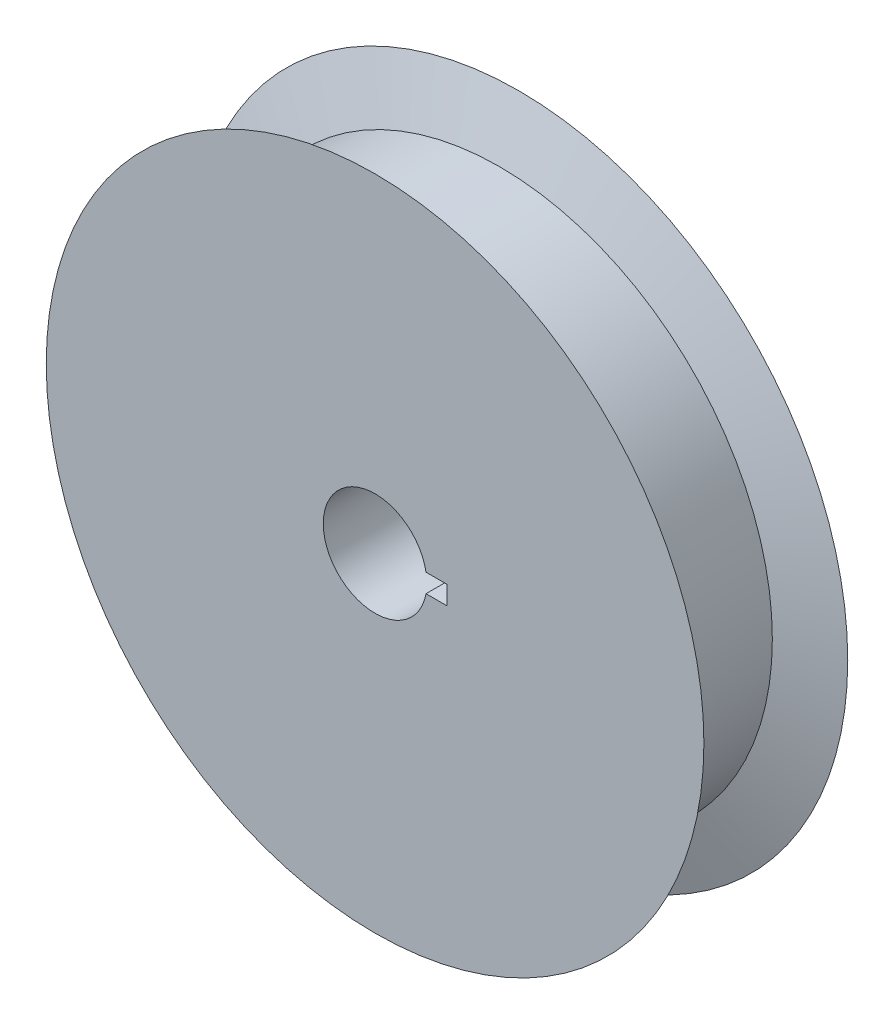
ISO-10303-21;
HEADER;
FILE_DESCRIPTION(('STEP AP214'),'2;1');
FILE_NAME('part.step','',(''),(''),'','','');
FILE_SCHEMA(('AUTOMOTIVE_DESIGN { 1 0 10303 214 1 1 1 1 }'));
ENDSEC;
DATA;
#1=APPLICATION_CONTEXT('core data for automotive mechanical design processes');
#2=APPLICATION_PROTOCOL_DEFINITION('international standard','automotive_design',2000,#1);
#3=PRODUCT_CONTEXT('',#1,'mechanical');
#4=PRODUCT('Part','Part','',(#3));
#5=PRODUCT_RELATED_PRODUCT_CATEGORY('part','',(#4));
#6=PRODUCT_DEFINITION_FORMATION('','',#4);
#7=PRODUCT_DEFINITION_CONTEXT('part definition',#1,'design');
#8=PRODUCT_DEFINITION('design','',#6,#7);
#9=PRODUCT_DEFINITION_SHAPE('','',#8);
#10=(LENGTH_UNIT() NAMED_UNIT(*) SI_UNIT(.MILLI.,.METRE.));
#11=(NAMED_UNIT(*) PLANE_ANGLE_UNIT() SI_UNIT($,.RADIAN.));
#12=(NAMED_UNIT(*) SI_UNIT($,.STERADIAN.) SOLID_ANGLE_UNIT());
#13=UNCERTAINTY_MEASURE_WITH_UNIT(LENGTH_MEASURE(1.E-05),#10,'distance_accuracy_value','');
#14=(GEOMETRIC_REPRESENTATION_CONTEXT(3) GLOBAL_UNCERTAINTY_ASSIGNED_CONTEXT((#13)) GLOBAL_UNIT_ASSIGNED_CONTEXT((#10,
#11,#12)) REPRESENTATION_CONTEXT('',''));
#15=CARTESIAN_POINT('',(0.,0.,0.));
#16=DIRECTION('',(0.,0.,1.));
#17=DIRECTION('',(1.,0.,0.));
#18=AXIS2_PLACEMENT_3D('',#15,#16,#17);
#19=CARTESIAN_POINT('',(0.,0.,-11.1125));
#20=DIRECTION('',(0.,0.,1.));
#21=DIRECTION('',(1.,0.,0.));
#22=AXIS2_PLACEMENT_3D('',#19,#20,#21);
#23=CYLINDRICAL_SURFACE('',#22,19.84375);
#24=CARTESIAN_POINT('',(0.,0.,-11.1125));
#25=DIRECTION('',(0.,0.,-1.));
#26=DIRECTION('',(-1.,0.,0.));
#27=AXIS2_PLACEMENT_3D('',#24,#25,#26);
#28=CIRCLE('',#27,19.84375);
#29=CARTESIAN_POINT('',(-19.84375,0.,-11.1125));
#30=VERTEX_POINT('',#29);
#31=EDGE_CURVE('E46',#30,#30,#28,.T.);
#32=ORIENTED_EDGE('',*,*,#31,.F.);
#33=EDGE_LOOP('',(#32));
#34=FACE_BOUND('',#33,.T.);
#35=CARTESIAN_POINT('',(0.,0.,0.));
#36=DIRECTION('',(0.,0.,1.));
#37=DIRECTION('',(1.,0.,0.));
#38=AXIS2_PLACEMENT_3D('',#35,#36,#37);
#39=CIRCLE('',#38,19.84375);
#40=CARTESIAN_POINT('',(19.84375,0.,0.));
#41=VERTEX_POINT('',#40);
#42=EDGE_CURVE('E11',#41,#41,#39,.F.);
#43=ORIENTED_EDGE('',*,*,#42,.T.);
#44=EDGE_LOOP('',(#43));
#45=FACE_BOUND('',#44,.T.);
#46=CARTESIAN_POINT('',(0.599890423792715,-19.8346803740807,-8.82142));
#47=CARTESIAN_POINT('',(0.782524509983104,-19.8291534895864,-8.82141249847861));
#48=CARTESIAN_POINT('',(0.965185526459327,-19.8210808827117,-8.80603868595143));
#49=CARTESIAN_POINT('',(1.32523040822756,-19.800272593288,-8.74504730881943));
#50=CARTESIAN_POINT('',(1.50260890170806,-19.7875323282485,-8.69939998728385));
#51=CARTESIAN_POINT('',(1.84683603593334,-19.7583761183908,-8.57933348223281));
#52=CARTESIAN_POINT('',(2.01369441319205,-19.7419636382215,-8.50494137097152));
#53=CARTESIAN_POINT('',(2.33248728805299,-19.7068431987552,-8.32956840396602));
#54=CARTESIAN_POINT('',(2.48442360478947,-19.6881355198905,-8.22859079477282));
#55=CARTESIAN_POINT('',(2.77078199721301,-19.6498928119747,-8.00169173870558));
#56=CARTESIAN_POINT('',(2.90501285759829,-19.6303513608421,-7.87552997100526));
#57=CARTESIAN_POINT('',(3.15046644696643,-19.5924586694176,-7.60234916596134));
#58=CARTESIAN_POINT('',(3.26168786768314,-19.5741074968432,-7.45532894345262));
#59=CARTESIAN_POINT('',(3.45833541574948,-19.5403264597695,-7.14383171214523));
#60=CARTESIAN_POINT('',(3.54366173331099,-19.5249079821006,-6.97929037913808));
#61=CARTESIAN_POINT('',(3.68535875947615,-19.4986607810287,-6.63783717778997));
#62=CARTESIAN_POINT('',(3.74173241135043,-19.4878315911073,-6.46092656896326));
#63=CARTESIAN_POINT('',(3.82315510187538,-19.4720212452471,-6.1024216905823));
#64=CARTESIAN_POINT('',(3.84863603423002,-19.4669595194875,-5.92092909600604));
#65=CARTESIAN_POINT('',(3.86889591276572,-19.4629436013964,-5.55617919490706));
#66=CARTESIAN_POINT('',(3.8636776781217,-19.4639888482475,-5.37292205196987));
#67=CARTESIAN_POINT('',(3.82299213116583,-19.4720197303387,-5.01242608826021));
#68=CARTESIAN_POINT('',(3.78792949441046,-19.478925890748,-4.83513958638341));
#69=CARTESIAN_POINT('',(3.6891847122177,-19.4978674541018,-4.48901830142034));
#70=CARTESIAN_POINT('',(3.62550144087117,-19.5099030588329,-4.32018385112034));
#71=CARTESIAN_POINT('',(3.47091705846591,-19.5379970201645,-3.99452785151613));
#72=CARTESIAN_POINT('',(3.37984617582573,-19.5540803635683,-3.83778912730296));
#73=CARTESIAN_POINT('',(3.17321968464956,-19.5886709972013,-3.54167696600686));
#74=CARTESIAN_POINT('',(3.05766152975907,-19.607178539439,-3.40230533726901));
#75=CARTESIAN_POINT('',(2.80303228514304,-19.6452090016996,-3.14238758066644));
#76=CARTESIAN_POINT('',(2.66359448826504,-19.6647438420214,-3.02220222634602));
#77=CARTESIAN_POINT('',(2.36642460819929,-19.7027118053351,-2.80687071010367));
#78=CARTESIAN_POINT('',(2.20869190450253,-19.7211448909266,-2.71172539782375));
#79=CARTESIAN_POINT('',(1.87846105996404,-19.7553397191632,-2.54880729687144));
#80=CARTESIAN_POINT('',(1.70589731671133,-19.7710885658476,-2.48116459958533));
#81=CARTESIAN_POINT('',(1.35151850417768,-19.7984687321293,-2.37597118676929));
#82=CARTESIAN_POINT('',(1.1697041956293,-19.8101003896852,-2.33841800102838));
#83=CARTESIAN_POINT('',(0.804297528032181,-19.8282772056889,-2.29489693793096));
#84=CARTESIAN_POINT('',(0.62075251865429,-19.8348815953964,-2.28855628556552));
#85=CARTESIAN_POINT('',(0.255087281798323,-19.8429530342105,-2.30672643072026));
#86=CARTESIAN_POINT('',(0.0729669670268542,-19.8444204005701,-2.33123532290199));
#87=CARTESIAN_POINT('',(-0.282769518539863,-19.842525083085,-2.41001061592434));
#88=CARTESIAN_POINT('',(-0.456452506550734,-19.8392105409672,-2.46397706663949));
#89=CARTESIAN_POINT('',(-0.792364046864503,-19.8286368101886,-2.59990241590775));
#90=CARTESIAN_POINT('',(-0.954592239698699,-19.821377497797,-2.68186219246282));
#91=CARTESIAN_POINT('',(-1.26385549613862,-19.8040707237293,-2.87189315825938));
#92=CARTESIAN_POINT('',(-1.41081450486803,-19.7940101452139,-2.98008687143314));
#93=CARTESIAN_POINT('',(-1.6846426778097,-19.772589419311,-3.2193551889561));
#94=CARTESIAN_POINT('',(-1.81151056862185,-19.7612291896285,-3.35043124251048));
#95=CARTESIAN_POINT('',(-2.04282149873691,-19.7386667920367,-3.63325079946684));
#96=CARTESIAN_POINT('',(-2.14703334978289,-19.7274672525678,-3.78518370321232));
#97=CARTESIAN_POINT('',(-2.32849950768364,-19.7068738973083,-4.10449008668269));
#98=CARTESIAN_POINT('',(-2.4057540783179,-19.697480063849,-4.27186341530134));
#99=CARTESIAN_POINT('',(-2.53102940743595,-19.6817762144738,-4.6172495784599));
#100=CARTESIAN_POINT('',(-2.5790670320249,-19.6754644198011,-4.79525620939216));
#101=CARTESIAN_POINT('',(-2.64453738905788,-19.6667725930545,-5.15690179714511));
#102=CARTESIAN_POINT('',(-2.66197186856113,-19.6643923365392,-5.34054043183937));
#103=CARTESIAN_POINT('',(-2.6656945555914,-19.6638879051079,-5.70662320241282));
#104=CARTESIAN_POINT('',(-2.65223763356427,-19.6657289024633,-5.8890647473597));
#105=CARTESIAN_POINT('',(-2.59510938459544,-19.6733484327069,-6.24906621767897));
#106=CARTESIAN_POINT('',(-2.55143802078154,-19.6791269704001,-6.4266261370938));
#107=CARTESIAN_POINT('',(-2.43521563545775,-19.6938452517373,-6.77172876582232));
#108=CARTESIAN_POINT('',(-2.36268666858494,-19.7027825806703,-6.93927901288874));
#109=CARTESIAN_POINT('',(-2.19082314021271,-19.7226306031439,-7.25988476273468));
#110=CARTESIAN_POINT('',(-2.09148778834772,-19.7335413548662,-7.41293983795547));
#111=CARTESIAN_POINT('',(-1.86787618480155,-19.7559647627085,-7.70152507933913));
#112=CARTESIAN_POINT('',(-1.74340710259615,-19.7674815295662,-7.83690554080009));
#113=CARTESIAN_POINT('',(-1.47344963611505,-19.7894330234818,-8.08495100145161));
#114=CARTESIAN_POINT('',(-1.32795693559095,-19.7998675275885,-8.19761132468407));
#115=CARTESIAN_POINT('',(-1.01960545504673,-19.8181410939428,-8.39725796891257));
#116=CARTESIAN_POINT('',(-0.856700803128048,-19.8259730653723,-8.48417407886074));
#117=CARTESIAN_POINT('',(-0.518567822446518,-19.8376915750152,-8.62930681502367));
#118=CARTESIAN_POINT('',(-0.343352231229247,-19.8415821287729,-8.68755261957237));
#119=CARTESIAN_POINT('',(-0.0395007245252097,-19.8441067366109,-8.76076969508109));
#120=CARTESIAN_POINT('',(0.0873155400006825,-19.8439687939424,-8.78348462432111));
#121=CARTESIAN_POINT('',(0.342713575512235,-19.8412013733928,-8.81381232144891));
#122=CARTESIAN_POINT('',(0.471295323962872,-19.8385719272848,-8.82142528192142));
#123=CARTESIAN_POINT('',(0.599890423792715,-19.8346803740807,-8.82142));
#124=B_SPLINE_CURVE_WITH_KNOTS('',3,(#46,#47,#48,#49,#50,#51,#52,#53,#54,#55,#56,#57,#58,#59,
#60,#61,#62,#63,#64,#65,#66,#67,#68,#69,#70,#71,#72,#73,#74,#75,#76,#77,#78,#79,#80,#81,#82,#83,
#84,#85,#86,#87,#88,#89,#90,#91,#92,#93,#94,#95,#96,#97,#98,#99,#100,#101,#102,#103,#104,#105,
#106,#107,#108,#109,#110,#111,#112,#113,#114,#115,#116,#117,#118,#119,#120,#121,#122,#123),
.UNSPECIFIED.,.T.,.F.,(4,2,2,2,2,2,2,2,2,2,2,2,2,2,2,2,2,2,2,2,2,2,2,2,2,2,2,2,2,2,2,2,2,2,2,2,
2,2,4),(0.,0.547680466177614,1.0959000668146,1.64360459996248,2.19124227987289,2.74437975721582,
3.2975486761012,3.85282340828864,4.40804168116817,4.95540477897936,5.50271761196672,
6.04272525294673,6.58275413918482,7.12620211112271,7.6697066222634,8.22246135628233,
8.77523484358881,9.33059343448603,9.88590642831567,10.4345708865416,10.983201459658,
11.5263471028145,12.0695097831299,12.6152598609373,13.1610445152327,13.7121612127405,
14.2632725173692,14.8140653785374,15.3648267952561,15.9110604871346,16.4572948456109,
17.0031125398509,17.5489463288631,18.099138859723,18.6494445086291,19.2012374473579,
19.752467648447,20.1381016986991,20.5237308312015),.UNSPECIFIED.);
#125=CARTESIAN_POINT('',(0.599890423792715,-19.8346803740807,-8.82142));
#126=VERTEX_POINT('',#125);
#127=EDGE_CURVE('E103',#126,#126,#124,.T.);
#128=ORIENTED_EDGE('',*,*,#127,.F.);
#129=EDGE_LOOP('',(#128));
#130=FACE_BOUND('',#129,.T.);
#131=ADVANCED_FACE('F33',(#34,#45,#130),#23,.T.);
#132=CARTESIAN_POINT('',(0.,0.,16.66748));
#133=DIRECTION('',(0.,0.,-1.));
#134=DIRECTION('',(-1.,0.,0.));
#135=AXIS2_PLACEMENT_3D('',#132,#133,#134);
#136=CYLINDRICAL_SURFACE('',#135,6.);
#137=CARTESIAN_POINT('',(0.,0.,-11.1125));
#138=DIRECTION('',(0.,0.,-1.));
#139=DIRECTION('',(-1.,0.,0.));
#140=AXIS2_PLACEMENT_3D('',#137,#138,#139);
#141=CIRCLE('',#140,6.);
#142=CARTESIAN_POINT('',(5.90226338505419,-1.07855780255333,-11.1125));
#143=VERTEX_POINT('',#142);
#144=CARTESIAN_POINT('',(5.90226338505419,1.07855780255334,-11.1125));
#145=VERTEX_POINT('',#144);
#146=EDGE_CURVE('E100',#143,#145,#141,.T.);
#147=ORIENTED_EDGE('',*,*,#146,.T.);
#148=DIRECTION('',(0.,0.,-1.));
#149=VECTOR('',#148,1.);
#150=CARTESIAN_POINT('',(5.90226338505419,1.07855780255334,16.66748));
#151=LINE('',#150,#149);
#152=CARTESIAN_POINT('',(5.90226338505419,1.07855780255334,16.66748));
#153=VERTEX_POINT('',#152);
#154=EDGE_CURVE('E118',#153,#145,#151,.T.);
#155=ORIENTED_EDGE('',*,*,#154,.F.);
#156=CARTESIAN_POINT('',(0.,0.,16.66748));
#157=DIRECTION('',(0.,0.,-1.));
#158=DIRECTION('',(-1.,0.,0.));
#159=AXIS2_PLACEMENT_3D('',#156,#157,#158);
#160=CIRCLE('',#159,6.);
#161=CARTESIAN_POINT('',(5.90226338505419,-1.07855780255334,16.66748));
#162=VERTEX_POINT('',#161);
#163=EDGE_CURVE('E53',#162,#153,#160,.T.);
#164=ORIENTED_EDGE('',*,*,#163,.F.);
#165=DIRECTION('',(0.,0.,-1.));
#166=VECTOR('',#165,1.);
#167=CARTESIAN_POINT('',(5.90226338505419,-1.07855780255333,16.66748));
#168=LINE('',#167,#166);
#169=EDGE_CURVE('E86',#162,#143,#168,.T.);
#170=ORIENTED_EDGE('',*,*,#169,.T.);
#171=EDGE_LOOP('',(#147,#155,#164,#170));
#172=FACE_BOUND('',#171,.T.);
#173=CARTESIAN_POINT('',(0.599890423792715,-5.96993563444714,-8.82142));
#174=CARTESIAN_POINT('',(0.517188567065031,-5.97824535937641,-8.8214193367522));
#175=CARTESIAN_POINT('',(0.434292466891896,-5.98483554052565,-8.8182721075559));
#176=CARTESIAN_POINT('',(0.268746068061959,-5.99455245827511,-8.8056402925649));
#177=CARTESIAN_POINT('',(0.186095930958278,-5.99767727475262,-8.79615219802353));
#178=CARTESIAN_POINT('',(0.0215623835931082,-6.00052584233722,-8.77085383742436));
#179=CARTESIAN_POINT('',(-0.0603195285123498,-6.00024394680347,-8.75503311697692));
#180=CARTESIAN_POINT('',(-0.222571835948983,-5.99642111021913,-8.71719619613604));
#181=CARTESIAN_POINT('',(-0.302941611205134,-5.99287886070412,-8.69517751080189));
#182=CARTESIAN_POINT('',(-0.540329290858641,-5.97771072316467,-8.62025396940035));
#183=CARTESIAN_POINT('',(-0.69433851158346,-5.9615522458911,-8.55837081703124));
#184=CARTESIAN_POINT('',(-0.990021720076639,-5.91964847555008,-8.41276882811694));
#185=CARTESIAN_POINT('',(-1.1316976129027,-5.89390466632671,-8.32905337189203));
#186=CARTESIAN_POINT('',(-1.40608553301741,-5.83467981578842,-8.13788736583231));
#187=CARTESIAN_POINT('',(-1.53810612535292,-5.80090243904,-8.02953739022671));
#188=CARTESIAN_POINT('',(-1.78333414714238,-5.7302741949364,-7.79408333655747));
#189=CARTESIAN_POINT('',(-1.89652924171249,-5.69342133601703,-7.66696706454681));
#190=CARTESIAN_POINT('',(-2.1113419649884,-5.61750555464239,-7.38415905181232));
#191=CARTESIAN_POINT('',(-2.21096550354705,-5.57854713846015,-7.22691905840363));
#192=CARTESIAN_POINT('',(-2.38255239518661,-5.50746176050839,-6.89641988188501));
#193=CARTESIAN_POINT('',(-2.45452159918646,-5.47533335433445,-6.72316409692291));
#194=CARTESIAN_POINT('',(-2.53914135272538,-5.4363296345809,-6.45644478177275));
#195=CARTESIAN_POINT('',(-2.56335147113455,-5.42491781662196,-6.36716934572491));
#196=CARTESIAN_POINT('',(-2.6041567949792,-5.40544959715944,-6.18655136800217));
#197=CARTESIAN_POINT('',(-2.62075562149105,-5.39739160024243,-6.09520983102541));
#198=CARTESIAN_POINT('',(-2.64611347912019,-5.38500562272272,-5.91123989044395));
#199=CARTESIAN_POINT('',(-2.6548766480278,-5.38067567348777,-5.81861219230098));
#200=CARTESIAN_POINT('',(-2.66446633521801,-5.37593114431687,-5.63287589576075));
#201=CARTESIAN_POINT('',(-2.66529355140702,-5.37551622008442,-5.53976734037178));
#202=CARTESIAN_POINT('',(-2.65642301044261,-5.37992046683034,-5.27899946243105));
#203=CARTESIAN_POINT('',(-2.63772378483922,-5.38921838573536,-5.11161776947799));
#204=CARTESIAN_POINT('',(-2.57516181366523,-5.41938114003802,-4.78281503429172));
#205=CARTESIAN_POINT('',(-2.53129267316566,-5.4402489149476,-4.6213955179685));
#206=CARTESIAN_POINT('',(-2.419729599324,-5.49077932125476,-4.30737028240446));
#207=CARTESIAN_POINT('',(-2.35188903178884,-5.52049590109273,-4.15482569569528));
#208=CARTESIAN_POINT('',(-2.19437906065333,-5.58497331089461,-3.86261935871359));
#209=CARTESIAN_POINT('',(-2.10470020956803,-5.61973632136487,-3.72296322028268));
#210=CARTESIAN_POINT('',(-1.89551213449476,-5.69390178086216,-3.44587475740554));
#211=CARTESIAN_POINT('',(-1.7739269546649,-5.73342250673631,-3.3100355525168));
#212=CARTESIAN_POINT('',(-1.50919852827073,-5.80872144774769,-3.05993082605811));
#213=CARTESIAN_POINT('',(-1.36604940360156,-5.84449863791631,-2.9456712060551));
#214=CARTESIAN_POINT('',(-1.05802401654371,-5.90811287016646,-2.7398322803931));
#215=CARTESIAN_POINT('',(-0.892753485432463,-5.93576671321788,-2.6487816234324));
#216=CARTESIAN_POINT('',(-0.547557714355909,-5.97748237576239,-2.49615896769573));
#217=CARTESIAN_POINT('',(-0.367645610383,-5.99155623617896,-2.43456087879416));
#218=CARTESIAN_POINT('',(-0.0160209937258541,-6.00232020953374,-2.34761586758588));
#219=CARTESIAN_POINT('',(0.154962609092308,-6.00046672768334,-2.3194953506414));
#220=CARTESIAN_POINT('',(0.49838284228537,-5.98173422815968,-2.29065562545005));
#221=CARTESIAN_POINT('',(0.670819018228775,-5.96485974858726,-2.28992814417178));
#222=CARTESIAN_POINT('',(1.00132127830687,-5.91807115305853,-2.31441682057784));
#223=CARTESIAN_POINT('',(1.1596285272518,-5.88900080715257,-2.3380778740155));
#224=CARTESIAN_POINT('',(1.46873572649464,-5.81961573610381,-2.40739995119003));
#225=CARTESIAN_POINT('',(1.61953440443176,-5.77929911281973,-2.45306468964548));
#226=CARTESIAN_POINT('',(1.91939862168803,-5.68700095979349,-2.56766414211319));
#227=CARTESIAN_POINT('',(2.06782003989894,-5.63446562147251,-2.63782819765501));
#228=CARTESIAN_POINT('',(2.35062869557352,-5.52247440818452,-2.79809656208447));
#229=CARTESIAN_POINT('',(2.48500663175966,-5.4630140010343,-2.88821396480293));
#230=CARTESIAN_POINT('',(2.75543126588085,-5.33227085079247,-3.09986297483871));
#231=CARTESIAN_POINT('',(2.88919287537042,-5.26048339044572,-3.22400529574516));
#232=CARTESIAN_POINT('',(3.13461153085831,-5.11804157601892,-3.49319778630338));
#233=CARTESIAN_POINT('',(3.24625926918708,-5.04738771051527,-3.63825671550024));
#234=CARTESIAN_POINT('',(3.43451342899638,-4.92093381601734,-3.93118314336683));
#235=CARTESIAN_POINT('',(3.5135783753732,-4.86435313309271,-4.07712711929554));
#236=CARTESIAN_POINT('',(3.64962287878785,-4.76313603722934,-4.38276877809673));
#237=CARTESIAN_POINT('',(3.70663884389103,-4.71847997200752,-4.54244325101573));
#238=CARTESIAN_POINT('',(3.78822009497184,-4.65313521156778,-4.84488578711542));
#239=CARTESIAN_POINT('',(3.81661938742818,-4.62968609715809,-4.98601081071865));
#240=CARTESIAN_POINT('',(3.85451547227756,-4.59818960148855,-5.27243700333557));
#241=CARTESIAN_POINT('',(3.86402919560087,-4.590128425177,-5.41773431321035));
#242=CARTESIAN_POINT('',(3.86354215159469,-4.59053827571288,-5.7084445157945));
#243=CARTESIAN_POINT('',(3.8535176481431,-4.59902941122925,-5.85385733429992));
#244=CARTESIAN_POINT('',(3.81458188225231,-4.63136871374297,-6.14040181505185));
#245=CARTESIAN_POINT('',(3.78565579658015,-4.65522893346441,-6.28153002619402));
#246=CARTESIAN_POINT('',(3.71046166426796,-4.71537525927461,-6.55639075701809));
#247=CARTESIAN_POINT('',(3.66417148108146,-4.75167722154446,-6.69011358517651));
#248=CARTESIAN_POINT('',(3.55602817006731,-4.83313978367942,-6.94816447127165));
#249=CARTESIAN_POINT('',(3.49416949385806,-4.87830354049031,-7.07248915926531));
#250=CARTESIAN_POINT('',(3.34231322531069,-4.98388624784201,-7.33505031165582));
#251=CARTESIAN_POINT('',(3.24915028618663,-5.04553846194759,-7.47095948097066));
#252=CARTESIAN_POINT('',(3.04427595005254,-5.17174034965515,-7.72659807140005));
#253=CARTESIAN_POINT('',(2.93254498443904,-5.23629302708829,-7.84631017858066));
#254=CARTESIAN_POINT('',(2.67013481220038,-5.37551995042824,-8.08822412738664));
#255=CARTESIAN_POINT('',(2.51606649056561,-5.44991052356016,-8.20695205135772));
#256=CARTESIAN_POINT('',(2.18650866438381,-5.59027910181928,-8.41650014381068));
#257=CARTESIAN_POINT('',(2.01102629262206,-5.65625989326223,-8.50732956971445));
#258=CARTESIAN_POINT('',(1.67411610460453,-5.76393517343034,-8.6439633593166));
#259=CARTESIAN_POINT('',(1.51547709346123,-5.80785542820408,-8.69482930089055));
#260=CARTESIAN_POINT('',(1.2713409964001,-5.86435810029413,-8.75270365351114));
#261=CARTESIAN_POINT('',(1.18901236963472,-5.88161763013508,-8.76891778099868));
#262=CARTESIAN_POINT('',(1.02274823384459,-5.91279270088121,-8.79500350414572));
#263=CARTESIAN_POINT('',(0.938813675895396,-5.926710158675,-8.80487874102242));
#264=CARTESIAN_POINT('',(0.81217765682956,-5.94492989497271,-8.81478470123907));
#265=CARTESIAN_POINT('',(0.769841143350834,-5.95056061461557,-8.81726887364567));
#266=CARTESIAN_POINT('',(0.684983745068645,-5.96092478998312,-8.82058688163287));
#267=CARTESIAN_POINT('',(0.642462820490539,-5.9656580411725,-8.82142034141976));
#268=CARTESIAN_POINT('',(0.599890423792715,-5.96993563444714,-8.82142));
#269=B_SPLINE_CURVE_WITH_KNOTS('',3,(#173,#174,#175,#176,#177,#178,#179,#180,#181,#182,#183,
#184,#185,#186,#187,#188,#189,#190,#191,#192,#193,#194,#195,#196,#197,#198,#199,#200,#201,#202,
#203,#204,#205,#206,#207,#208,#209,#210,#211,#212,#213,#214,#215,#216,#217,#218,#219,#220,#221,
#222,#223,#224,#225,#226,#227,#228,#229,#230,#231,#232,#233,#234,#235,#236,#237,#238,#239,#240,
#241,#242,#243,#244,#245,#246,#247,#248,#249,#250,#251,#252,#253,#254,#255,#256,#257,#258,#259,
#260,#261,#262,#263,#264,#265,#266,#267,#268),.UNSPECIFIED.,.T.,.F.,(4,2,2,2,2,2,2,2,2,2,2,2,2,
2,2,2,2,2,2,2,2,2,2,2,2,2,2,2,2,2,2,2,2,2,2,2,2,2,2,2,2,2,2,2,2,2,2,4),(0.,0.249312494007734,
0.498763060574063,0.748627149231644,0.99859155855711,1.49638361659998,1.99409864664728,
2.51423759942922,3.03471602743695,3.60260928292767,4.17038232112262,4.44965894831239,
4.72880257128602,5.00779869916068,5.28677029123249,5.79014479460623,6.29364724718376,
6.80028453924659,7.30714139884222,7.86424816306654,8.42150706446638,8.99050841414128,
9.55900478418075,10.0761118300404,10.5930627020023,11.078974432308,11.5649682242359,
12.0800543574044,12.5954795086668,13.1813941708698,13.7675549213801,14.2916537149107,
14.8148833644424,15.2505436533512,15.6858131956994,16.1216118572503,16.5577526970632,
16.9944514493313,17.4313060555318,17.9571768798284,18.4836054686682,19.1053520528119,
19.7268921023931,20.2413299697301,20.4980703593581,20.7546631386,20.8829724093664,
21.0113108870812),.UNSPECIFIED.);
#270=CARTESIAN_POINT('',(0.599890423792715,-5.96993563444714,-8.82142));
#271=VERTEX_POINT('',#270);
#272=EDGE_CURVE('E37',#271,#271,#269,.T.);
#273=ORIENTED_EDGE('',*,*,#272,.F.);
#274=EDGE_LOOP('',(#273));
#275=FACE_BOUND('',#274,.T.);
#276=ADVANCED_FACE('F128',(#172,#275),#136,.F.);
#277=CARTESIAN_POINT('',(0.,0.,16.66748));
#278=DIRECTION('',(0.,0.,1.));
#279=DIRECTION('',(1.,0.,0.));
#280=AXIS2_PLACEMENT_3D('',#277,#278,#279);
#281=PLANE('',#280);
#282=DIRECTION('',(0.,-1.,0.));
#283=VECTOR('',#282,1.);
#284=CARTESIAN_POINT('',(8.31526338505419,-1.07855780255334,16.66748));
#285=LINE('',#284,#283);
#286=CARTESIAN_POINT('',(8.31526338505419,1.07855780255334,16.66748));
#287=VERTEX_POINT('',#286);
#288=CARTESIAN_POINT('',(8.31526338505419,-1.07855780255334,16.66748));
#289=VERTEX_POINT('',#288);
#290=EDGE_CURVE('E81',#287,#289,#285,.T.);
#291=ORIENTED_EDGE('',*,*,#290,.T.);
#292=DIRECTION('',(-1.,0.,0.));
#293=VECTOR('',#292,1.);
#294=CARTESIAN_POINT('',(5.90226338505419,-1.07855780255334,16.66748));
#295=LINE('',#294,#293);
#296=EDGE_CURVE('E90',#289,#162,#295,.T.);
#297=ORIENTED_EDGE('',*,*,#296,.T.);
#298=ORIENTED_EDGE('',*,*,#163,.T.);
#299=DIRECTION('',(1.,0.,0.));
#300=VECTOR('',#299,1.);
#301=CARTESIAN_POINT('',(5.90226338505419,1.07855780255334,16.66748));
#302=LINE('',#301,#300);
#303=EDGE_CURVE('E87',#153,#287,#302,.T.);
#304=ORIENTED_EDGE('',*,*,#303,.T.);
#305=EDGE_LOOP('',(#291,#297,#298,#304));
#306=FACE_BOUND('',#305,.T.);
#307=CARTESIAN_POINT('',(0.,0.,16.66748));
#308=DIRECTION('',(0.,0.,1.));
#309=DIRECTION('',(1.,0.,0.));
#310=AXIS2_PLACEMENT_3D('',#307,#308,#309);
#311=CIRCLE('',#310,38.1);
#312=CARTESIAN_POINT('',(38.1,0.,16.66748));
#313=VERTEX_POINT('',#312);
#314=EDGE_CURVE('E148',#313,#313,#311,.T.);
#315=ORIENTED_EDGE('',*,*,#314,.T.);
#316=EDGE_LOOP('',(#315));
#317=FACE_BOUND('',#316,.T.);
#318=ADVANCED_FACE('F94',(#306,#317),#281,.T.);
#319=CARTESIAN_POINT('',(0.,0.,0.));
#320=DIRECTION('',(0.,0.,1.));
#321=DIRECTION('',(1.,0.,0.));
#322=AXIS2_PLACEMENT_3D('',#319,#320,#321);
#323=PLANE('',#322);
#324=ORIENTED_EDGE('',*,*,#42,.F.);
#325=EDGE_LOOP('',(#324));
#326=FACE_BOUND('',#325,.T.);
#327=CARTESIAN_POINT('',(0.,0.,0.));
#328=DIRECTION('',(0.,0.,1.));
#329=DIRECTION('',(1.,0.,0.));
#330=AXIS2_PLACEMENT_3D('',#327,#328,#329);
#331=CIRCLE('',#330,38.1);
#332=CARTESIAN_POINT('',(38.1,0.,0.));
#333=VERTEX_POINT('',#332);
#334=EDGE_CURVE('E143',#333,#333,#331,.T.);
#335=ORIENTED_EDGE('',*,*,#334,.F.);
#336=EDGE_LOOP('',(#335));
#337=FACE_BOUND('',#336,.T.);
#338=ADVANCED_FACE('F35',(#326,#337),#323,.F.);
#339=CARTESIAN_POINT('',(0.,0.,-11.1125));
#340=DIRECTION('',(0.,0.,-1.));
#341=DIRECTION('',(-1.,0.,0.));
#342=AXIS2_PLACEMENT_3D('',#339,#340,#341);
#343=PLANE('',#342);
#344=DIRECTION('',(0.,-1.,0.));
#345=VECTOR('',#344,1.);
#346=CARTESIAN_POINT('',(8.31526338505419,-1.07855780255334,-11.1125));
#347=LINE('',#346,#345);
#348=CARTESIAN_POINT('',(8.31526338505419,1.07855780255334,-11.1125));
#349=VERTEX_POINT('',#348);
#350=CARTESIAN_POINT('',(8.31526338505419,-1.07855780255334,-11.1125));
#351=VERTEX_POINT('',#350);
#352=EDGE_CURVE('E61',#349,#351,#347,.T.);
#353=ORIENTED_EDGE('',*,*,#352,.F.);
#354=DIRECTION('',(1.,0.,0.));
#355=VECTOR('',#354,1.);
#356=CARTESIAN_POINT('',(5.90226338505419,1.07855780255334,-11.1125));
#357=LINE('',#356,#355);
#358=EDGE_CURVE('E97',#145,#349,#357,.T.);
#359=ORIENTED_EDGE('',*,*,#358,.F.);
#360=ORIENTED_EDGE('',*,*,#146,.F.);
#361=DIRECTION('',(-1.,0.,0.));
#362=VECTOR('',#361,1.);
#363=CARTESIAN_POINT('',(5.90226338505419,-1.07855780255334,-11.1125));
#364=LINE('',#363,#362);
#365=EDGE_CURVE('E112',#351,#143,#364,.T.);
#366=ORIENTED_EDGE('',*,*,#365,.F.);
#367=EDGE_LOOP('',(#353,#359,#360,#366));
#368=FACE_BOUND('',#367,.T.);
#369=ORIENTED_EDGE('',*,*,#31,.T.);
#370=EDGE_LOOP('',(#369));
#371=FACE_BOUND('',#370,.T.);
#372=ADVANCED_FACE('F124',(#368,#371),#343,.T.);
#373=CARTESIAN_POINT('',(8.31526338505419,-1.07855780255334,16.66748));
#374=DIRECTION('',(1.,0.,0.));
#375=DIRECTION('',(0.,0.,-1.));
#376=AXIS2_PLACEMENT_3D('',#373,#374,#375);
#377=PLANE('',#376);
#378=ORIENTED_EDGE('',*,*,#352,.T.);
#379=DIRECTION('',(0.,0.,-1.));
#380=VECTOR('',#379,1.);
#381=CARTESIAN_POINT('',(8.31526338505419,-1.07855780255334,16.66748));
#382=LINE('',#381,#380);
#383=EDGE_CURVE('E77',#289,#351,#382,.T.);
#384=ORIENTED_EDGE('',*,*,#383,.F.);
#385=ORIENTED_EDGE('',*,*,#290,.F.);
#386=DIRECTION('',(0.,0.,-1.));
#387=VECTOR('',#386,1.);
#388=CARTESIAN_POINT('',(8.31526338505419,1.07855780255334,16.66748));
#389=LINE('',#388,#387);
#390=EDGE_CURVE('E116',#287,#349,#389,.T.);
#391=ORIENTED_EDGE('',*,*,#390,.T.);
#392=EDGE_LOOP('',(#378,#384,#385,#391));
#393=FACE_BOUND('',#392,.T.);
#394=ADVANCED_FACE('F79',(#393),#377,.F.);
#395=CARTESIAN_POINT('',(5.90226338505419,1.07855780255334,16.66748));
#396=DIRECTION('',(0.,1.,0.));
#397=DIRECTION('',(0.,0.,1.));
#398=AXIS2_PLACEMENT_3D('',#395,#396,#397);
#399=PLANE('',#398);
#400=ORIENTED_EDGE('',*,*,#358,.T.);
#401=ORIENTED_EDGE('',*,*,#390,.F.);
#402=ORIENTED_EDGE('',*,*,#303,.F.);
#403=ORIENTED_EDGE('',*,*,#154,.T.);
#404=EDGE_LOOP('',(#400,#401,#402,#403));
#405=FACE_BOUND('',#404,.T.);
#406=ADVANCED_FACE('F167',(#405),#399,.F.);
#407=CARTESIAN_POINT('',(5.90226338505419,-1.07855780255334,16.66748));
#408=DIRECTION('',(0.,-1.,0.));
#409=DIRECTION('',(1.,0.,0.));
#410=AXIS2_PLACEMENT_3D('',#407,#408,#409);
#411=PLANE('',#410);
#412=ORIENTED_EDGE('',*,*,#365,.T.);
#413=ORIENTED_EDGE('',*,*,#169,.F.);
#414=ORIENTED_EDGE('',*,*,#296,.F.);
#415=ORIENTED_EDGE('',*,*,#383,.T.);
#416=EDGE_LOOP('',(#412,#413,#414,#415));
#417=FACE_BOUND('',#416,.T.);
#418=ADVANCED_FACE('F91',(#417),#411,.F.);
#419=CARTESIAN_POINT('',(0.599890423792715,1.5875,-5.55752));
#420=DIRECTION('',(0.,-1.,0.));
#421=DIRECTION('',(0.,0.,-1.));
#422=AXIS2_PLACEMENT_3D('',#419,#420,#421);
#423=CYLINDRICAL_SURFACE('',#422,3.2639);
#424=ORIENTED_EDGE('',*,*,#272,.T.);
#425=EDGE_LOOP('',(#424));
#426=FACE_BOUND('',#425,.T.);
#427=ORIENTED_EDGE('',*,*,#127,.T.);
#428=EDGE_LOOP('',(#427));
#429=FACE_BOUND('',#428,.T.);
#430=ADVANCED_FACE('F155',(#426,#429),#423,.F.);
#431=CARTESIAN_POINT('',(0.,0.,16.66748));
#432=DIRECTION('',(0.,0.,1.));
#433=DIRECTION('',(1.,0.,0.));
#434=AXIS2_PLACEMENT_3D('',#431,#432,#433);
#435=CONICAL_SURFACE('',#434,38.1,1.23918376891597);
#436=CARTESIAN_POINT('',(0.,0.,14.42974));
#437=DIRECTION('',(0.,0.,1.));
#438=DIRECTION('',(1.,0.,0.));
#439=AXIS2_PLACEMENT_3D('',#436,#437,#438);
#440=CIRCLE('',#439,31.6011311505897);
#441=CARTESIAN_POINT('',(31.6011311505897,0.,14.42974));
#442=VERTEX_POINT('',#441);
#443=EDGE_CURVE('E135',#442,#442,#440,.T.);
#444=ORIENTED_EDGE('',*,*,#443,.T.);
#445=EDGE_LOOP('',(#444));
#446=FACE_BOUND('',#445,.T.);
#447=ORIENTED_EDGE('',*,*,#314,.F.);
#448=EDGE_LOOP('',(#447));
#449=FACE_BOUND('',#448,.T.);
#450=ADVANCED_FACE('F152',(#446,#449),#435,.T.);
#451=CARTESIAN_POINT('',(0.,0.,16.66748));
#452=DIRECTION('',(0.,0.,1.));
#453=DIRECTION('',(1.,0.,0.));
#454=AXIS2_PLACEMENT_3D('',#451,#452,#453);
#455=CYLINDRICAL_SURFACE('',#454,31.6011311505897);
#456=CARTESIAN_POINT('',(0.,0.,2.23774));
#457=DIRECTION('',(0.,0.,1.));
#458=DIRECTION('',(1.,0.,0.));
#459=AXIS2_PLACEMENT_3D('',#456,#457,#458);
#460=CIRCLE('',#459,31.6011311505897);
#461=CARTESIAN_POINT('',(31.6011311505897,0.,2.23774));
#462=VERTEX_POINT('',#461);
#463=EDGE_CURVE('E139',#462,#462,#460,.T.);
#464=ORIENTED_EDGE('',*,*,#463,.T.);
#465=EDGE_LOOP('',(#464));
#466=FACE_BOUND('',#465,.T.);
#467=ORIENTED_EDGE('',*,*,#443,.F.);
#468=EDGE_LOOP('',(#467));
#469=FACE_BOUND('',#468,.T.);
#470=ADVANCED_FACE('F154',(#466,#469),#455,.T.);
#471=CARTESIAN_POINT('',(0.,0.,0.));
#472=DIRECTION('',(0.,0.,-1.));
#473=DIRECTION('',(-1.,0.,0.));
#474=AXIS2_PLACEMENT_3D('',#471,#472,#473);
#475=CONICAL_SURFACE('',#474,38.1,1.23918376891597);
#476=ORIENTED_EDGE('',*,*,#463,.F.);
#477=EDGE_LOOP('',(#476));
#478=FACE_BOUND('',#477,.T.);
#479=ORIENTED_EDGE('',*,*,#334,.T.);
#480=EDGE_LOOP('',(#479));
#481=FACE_BOUND('',#480,.T.);
#482=ADVANCED_FACE('F161',(#478,#481),#475,.T.);
#483=CLOSED_SHELL('',(#131,#276,#318,#338,#372,#394,#406,#418,#430,#450,#470,#482));
#484=MANIFOLD_SOLID_BREP('B2',#483);
#485=ADVANCED_BREP_SHAPE_REPRESENTATION('',(#18,#484),#14);
#486=SHAPE_DEFINITION_REPRESENTATION(#9,#485);
ENDSEC;
END-ISO-10303-21;
